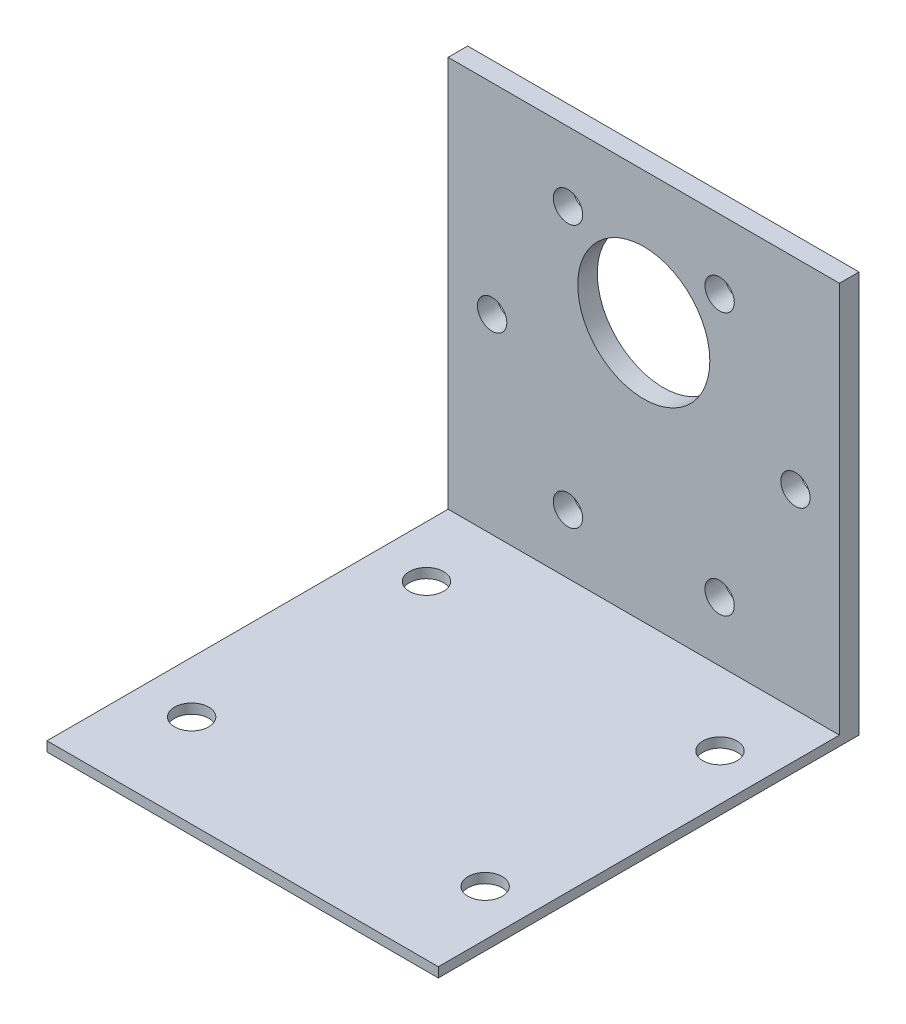
ISO-10303-21;
HEADER;
FILE_DESCRIPTION(('STEP AP214'),'2;1');
FILE_NAME('part.step','',(''),(''),'','','');
FILE_SCHEMA(('AUTOMOTIVE_DESIGN { 1 0 10303 214 1 1 1 1 }'));
ENDSEC;
DATA;
#1=APPLICATION_CONTEXT('core data for automotive mechanical design processes');
#2=APPLICATION_PROTOCOL_DEFINITION('international standard','automotive_design',2000,#1);
#3=PRODUCT_CONTEXT('',#1,'mechanical');
#4=PRODUCT('Part','Part','',(#3));
#5=PRODUCT_RELATED_PRODUCT_CATEGORY('part','',(#4));
#6=PRODUCT_DEFINITION_FORMATION('','',#4);
#7=PRODUCT_DEFINITION_CONTEXT('part definition',#1,'design');
#8=PRODUCT_DEFINITION('design','',#6,#7);
#9=PRODUCT_DEFINITION_SHAPE('','',#8);
#10=(LENGTH_UNIT() NAMED_UNIT(*) SI_UNIT(.MILLI.,.METRE.));
#11=(NAMED_UNIT(*) PLANE_ANGLE_UNIT() SI_UNIT($,.RADIAN.));
#12=(NAMED_UNIT(*) SI_UNIT($,.STERADIAN.) SOLID_ANGLE_UNIT());
#13=UNCERTAINTY_MEASURE_WITH_UNIT(LENGTH_MEASURE(1.E-05),#10,'distance_accuracy_value','');
#14=(GEOMETRIC_REPRESENTATION_CONTEXT(3) GLOBAL_UNCERTAINTY_ASSIGNED_CONTEXT((#13)) GLOBAL_UNIT_ASSIGNED_CONTEXT((#10,
#11,#12)) REPRESENTATION_CONTEXT('',''));
#15=CARTESIAN_POINT('',(0.,0.,0.));
#16=DIRECTION('',(0.,0.,1.));
#17=DIRECTION('',(1.,0.,0.));
#18=AXIS2_PLACEMENT_3D('',#15,#16,#17);
#19=CARTESIAN_POINT('',(0.,-1.,21.5));
#20=DIRECTION('',(0.,0.,1.));
#21=DIRECTION('',(1.,0.,0.));
#22=AXIS2_PLACEMENT_3D('',#19,#20,#21);
#23=PLANE('',#22);
#24=DIRECTION('',(1.,0.,0.));
#25=VECTOR('',#24,1.);
#26=CARTESIAN_POINT('',(0.,0.,21.5));
#27=LINE('',#26,#25);
#28=CARTESIAN_POINT('',(-20.,0.,21.5));
#29=VERTEX_POINT('',#28);
#30=CARTESIAN_POINT('',(20.,0.,21.5));
#31=VERTEX_POINT('',#30);
#32=EDGE_CURVE('E154',#29,#31,#27,.T.);
#33=ORIENTED_EDGE('',*,*,#32,.F.);
#34=DIRECTION('',(0.,1.,0.));
#35=VECTOR('',#34,1.);
#36=CARTESIAN_POINT('',(-20.,-1.,21.5));
#37=LINE('',#36,#35);
#38=CARTESIAN_POINT('',(-20.,-1.,21.5));
#39=VERTEX_POINT('',#38);
#40=EDGE_CURVE('E11',#39,#29,#37,.T.);
#41=ORIENTED_EDGE('',*,*,#40,.F.);
#42=DIRECTION('',(1.,0.,0.));
#43=VECTOR('',#42,1.);
#44=CARTESIAN_POINT('',(0.,-1.,21.5));
#45=LINE('',#44,#43);
#46=CARTESIAN_POINT('',(20.,-1.,21.5));
#47=VERTEX_POINT('',#46);
#48=EDGE_CURVE('E137',#39,#47,#45,.T.);
#49=ORIENTED_EDGE('',*,*,#48,.T.);
#50=DIRECTION('',(0.,1.,0.));
#51=VECTOR('',#50,1.);
#52=CARTESIAN_POINT('',(20.,-1.,21.5));
#53=LINE('',#52,#51);
#54=EDGE_CURVE('E39',#47,#31,#53,.T.);
#55=ORIENTED_EDGE('',*,*,#54,.T.);
#56=EDGE_LOOP('',(#33,#41,#49,#55));
#57=FACE_BOUND('',#56,.T.);
#58=ADVANCED_FACE('F35',(#57),#23,.T.);
#59=CARTESIAN_POINT('',(-20.,-1.,0.));
#60=DIRECTION('',(1.,0.,0.));
#61=DIRECTION('',(0.,0.,-1.));
#62=AXIS2_PLACEMENT_3D('',#59,#60,#61);
#63=PLANE('',#62);
#64=DIRECTION('',(0.,0.,-1.));
#65=VECTOR('',#64,1.);
#66=CARTESIAN_POINT('',(-20.,0.,0.));
#67=LINE('',#66,#65);
#68=CARTESIAN_POINT('',(-20.,0.,-19.5));
#69=VERTEX_POINT('',#68);
#70=EDGE_CURVE('E116',#29,#69,#67,.T.);
#71=ORIENTED_EDGE('',*,*,#70,.T.);
#72=DIRECTION('',(0.,-1.,0.));
#73=VECTOR('',#72,1.);
#74=CARTESIAN_POINT('',(-20.,40.,-19.5));
#75=LINE('',#74,#73);
#76=CARTESIAN_POINT('',(-20.,40.,-19.5));
#77=VERTEX_POINT('',#76);
#78=EDGE_CURVE('E99',#77,#69,#75,.T.);
#79=ORIENTED_EDGE('',*,*,#78,.F.);
#80=DIRECTION('',(0.,0.,1.));
#81=VECTOR('',#80,1.);
#82=CARTESIAN_POINT('',(-20.,40.,0.));
#83=LINE('',#82,#81);
#84=CARTESIAN_POINT('',(-20.,40.,-21.5));
#85=VERTEX_POINT('',#84);
#86=EDGE_CURVE('E106',#85,#77,#83,.T.);
#87=ORIENTED_EDGE('',*,*,#86,.F.);
#88=DIRECTION('',(0.,1.,0.));
#89=VECTOR('',#88,1.);
#90=CARTESIAN_POINT('',(-20.,-1.,-21.5));
#91=LINE('',#90,#89);
#92=CARTESIAN_POINT('',(-20.,-1.,-21.5));
#93=VERTEX_POINT('',#92);
#94=EDGE_CURVE('E44',#93,#85,#91,.T.);
#95=ORIENTED_EDGE('',*,*,#94,.F.);
#96=DIRECTION('',(0.,0.,-1.));
#97=VECTOR('',#96,1.);
#98=CARTESIAN_POINT('',(-20.,-1.,0.));
#99=LINE('',#98,#97);
#100=EDGE_CURVE('E143',#39,#93,#99,.T.);
#101=ORIENTED_EDGE('',*,*,#100,.F.);
#102=ORIENTED_EDGE('',*,*,#40,.T.);
#103=EDGE_LOOP('',(#71,#79,#87,#95,#101,#102));
#104=FACE_BOUND('',#103,.T.);
#105=ADVANCED_FACE('F115',(#104),#63,.F.);
#106=CARTESIAN_POINT('',(0.,-1.,-21.5));
#107=DIRECTION('',(0.,0.,1.));
#108=DIRECTION('',(1.,0.,0.));
#109=AXIS2_PLACEMENT_3D('',#106,#107,#108);
#110=PLANE('',#109);
#111=CARTESIAN_POINT('',(-7.74999999999997,6.0766062413414,-21.5));
#112=DIRECTION('',(0.,0.,1.));
#113=DIRECTION('',(1.,0.,0.));
#114=AXIS2_PLACEMENT_3D('',#111,#112,#113);
#115=CIRCLE('',#114,1.5);
#116=CARTESIAN_POINT('',(-6.24999999999997,6.0766062413414,-21.5));
#117=VERTEX_POINT('',#116);
#118=EDGE_CURVE('E263',#117,#117,#115,.T.);
#119=ORIENTED_EDGE('',*,*,#118,.T.);
#120=EDGE_LOOP('',(#119));
#121=FACE_BOUND('',#120,.T.);
#122=CARTESIAN_POINT('',(-15.5,19.5,-21.5));
#123=DIRECTION('',(0.,0.,1.));
#124=DIRECTION('',(1.,0.,0.));
#125=AXIS2_PLACEMENT_3D('',#122,#123,#124);
#126=CIRCLE('',#125,1.5);
#127=CARTESIAN_POINT('',(-14.,19.5,-21.5));
#128=VERTEX_POINT('',#127);
#129=EDGE_CURVE('E260',#128,#128,#126,.T.);
#130=ORIENTED_EDGE('',*,*,#129,.T.);
#131=EDGE_LOOP('',(#130));
#132=FACE_BOUND('',#131,.T.);
#133=CARTESIAN_POINT('',(-7.75000000000015,32.9233937586589,-21.5));
#134=DIRECTION('',(0.,0.,1.));
#135=DIRECTION('',(1.,0.,0.));
#136=AXIS2_PLACEMENT_3D('',#133,#134,#135);
#137=CIRCLE('',#136,1.5);
#138=CARTESIAN_POINT('',(-6.25000000000015,32.9233937586589,-21.5));
#139=VERTEX_POINT('',#138);
#140=EDGE_CURVE('E251',#139,#139,#137,.T.);
#141=ORIENTED_EDGE('',*,*,#140,.T.);
#142=EDGE_LOOP('',(#141));
#143=FACE_BOUND('',#142,.T.);
#144=CARTESIAN_POINT('',(7.74999999999987,32.9233937586591,-21.5));
#145=DIRECTION('',(0.,0.,1.));
#146=DIRECTION('',(1.,0.,0.));
#147=AXIS2_PLACEMENT_3D('',#144,#145,#146);
#148=CIRCLE('',#147,1.5);
#149=CARTESIAN_POINT('',(9.24999999999987,32.9233937586591,-21.5));
#150=VERTEX_POINT('',#149);
#151=EDGE_CURVE('E247',#150,#150,#148,.T.);
#152=ORIENTED_EDGE('',*,*,#151,.T.);
#153=EDGE_LOOP('',(#152));
#154=FACE_BOUND('',#153,.T.);
#155=CARTESIAN_POINT('',(15.5,19.5000000000003,-21.5));
#156=DIRECTION('',(0.,0.,1.));
#157=DIRECTION('',(1.,0.,0.));
#158=AXIS2_PLACEMENT_3D('',#155,#156,#157);
#159=CIRCLE('',#158,1.5);
#160=CARTESIAN_POINT('',(17.,19.5000000000003,-21.5));
#161=VERTEX_POINT('',#160);
#162=EDGE_CURVE('E245',#161,#161,#159,.T.);
#163=ORIENTED_EDGE('',*,*,#162,.T.);
#164=EDGE_LOOP('',(#163));
#165=FACE_BOUND('',#164,.T.);
#166=CARTESIAN_POINT('',(7.75000000000007,6.07660624134145,-21.5));
#167=DIRECTION('',(0.,0.,1.));
#168=DIRECTION('',(1.,0.,0.));
#169=AXIS2_PLACEMENT_3D('',#166,#167,#168);
#170=CIRCLE('',#169,1.5);
#171=CARTESIAN_POINT('',(9.25000000000007,6.07660624134145,-21.5));
#172=VERTEX_POINT('',#171);
#173=EDGE_CURVE('E248',#172,#172,#170,.T.);
#174=ORIENTED_EDGE('',*,*,#173,.T.);
#175=EDGE_LOOP('',(#174));
#176=FACE_BOUND('',#175,.T.);
#177=CARTESIAN_POINT('',(0.,26.5,-21.5));
#178=DIRECTION('',(0.,0.,1.));
#179=DIRECTION('',(1.,0.,0.));
#180=AXIS2_PLACEMENT_3D('',#177,#178,#179);
#181=CIRCLE('',#180,6.75);
#182=CARTESIAN_POINT('',(6.75,26.5,-21.5));
#183=VERTEX_POINT('',#182);
#184=EDGE_CURVE('E269',#183,#183,#181,.T.);
#185=ORIENTED_EDGE('',*,*,#184,.T.);
#186=EDGE_LOOP('',(#185));
#187=FACE_BOUND('',#186,.T.);
#188=ORIENTED_EDGE('',*,*,#94,.T.);
#189=DIRECTION('',(-1.,0.,0.));
#190=VECTOR('',#189,1.);
#191=CARTESIAN_POINT('',(0.,40.,-21.5));
#192=LINE('',#191,#190);
#193=CARTESIAN_POINT('',(20.,40.,-21.5));
#194=VERTEX_POINT('',#193);
#195=EDGE_CURVE('E112',#194,#85,#192,.T.);
#196=ORIENTED_EDGE('',*,*,#195,.F.);
#197=DIRECTION('',(0.,1.,0.));
#198=VECTOR('',#197,1.);
#199=CARTESIAN_POINT('',(20.,-1.,-21.5));
#200=LINE('',#199,#198);
#201=CARTESIAN_POINT('',(20.,-1.,-21.5));
#202=VERTEX_POINT('',#201);
#203=EDGE_CURVE('E160',#202,#194,#200,.T.);
#204=ORIENTED_EDGE('',*,*,#203,.F.);
#205=DIRECTION('',(1.,0.,0.));
#206=VECTOR('',#205,1.);
#207=CARTESIAN_POINT('',(0.,-1.,-21.5));
#208=LINE('',#207,#206);
#209=EDGE_CURVE('E141',#93,#202,#208,.T.);
#210=ORIENTED_EDGE('',*,*,#209,.F.);
#211=EDGE_LOOP('',(#188,#196,#204,#210));
#212=FACE_BOUND('',#211,.T.);
#213=ADVANCED_FACE('F180',(#121,#132,#143,#154,#165,#176,#187,#212),#110,.F.);
#214=CARTESIAN_POINT('',(-14.7150530034863,-1.,-12.));
#215=DIRECTION('',(0.,1.,0.));
#216=DIRECTION('',(0.,0.,1.));
#217=AXIS2_PLACEMENT_3D('',#214,#215,#216);
#218=CYLINDRICAL_SURFACE('',#217,1.75);
#219=CARTESIAN_POINT('',(-14.7150530034863,-1.,-12.));
#220=DIRECTION('',(0.,1.,0.));
#221=DIRECTION('',(0.,0.,1.));
#222=AXIS2_PLACEMENT_3D('',#219,#220,#221);
#223=CIRCLE('',#222,1.75);
#224=CARTESIAN_POINT('',(-14.7150530034863,-1.,-10.25));
#225=VERTEX_POINT('',#224);
#226=EDGE_CURVE('E134',#225,#225,#223,.T.);
#227=ORIENTED_EDGE('',*,*,#226,.F.);
#228=EDGE_LOOP('',(#227));
#229=FACE_BOUND('',#228,.T.);
#230=CARTESIAN_POINT('',(-14.7150530034863,0.,-12.));
#231=DIRECTION('',(0.,1.,0.));
#232=DIRECTION('',(0.,0.,1.));
#233=AXIS2_PLACEMENT_3D('',#230,#231,#232);
#234=CIRCLE('',#233,1.75);
#235=CARTESIAN_POINT('',(-14.7150530034863,0.,-10.25));
#236=VERTEX_POINT('',#235);
#237=EDGE_CURVE('E151',#236,#236,#234,.T.);
#238=ORIENTED_EDGE('',*,*,#237,.T.);
#239=EDGE_LOOP('',(#238));
#240=FACE_BOUND('',#239,.T.);
#241=ADVANCED_FACE('F177',(#229,#240),#218,.F.);
#242=CARTESIAN_POINT('',(15.2849469965137,-1.,-12.));
#243=DIRECTION('',(0.,1.,0.));
#244=DIRECTION('',(0.,0.,1.));
#245=AXIS2_PLACEMENT_3D('',#242,#243,#244);
#246=CYLINDRICAL_SURFACE('',#245,1.75);
#247=CARTESIAN_POINT('',(15.2849469965137,-1.,-12.));
#248=DIRECTION('',(0.,1.,0.));
#249=DIRECTION('',(0.,0.,1.));
#250=AXIS2_PLACEMENT_3D('',#247,#248,#249);
#251=CIRCLE('',#250,1.75);
#252=CARTESIAN_POINT('',(15.2849469965137,-1.,-10.25));
#253=VERTEX_POINT('',#252);
#254=EDGE_CURVE('E131',#253,#253,#251,.T.);
#255=ORIENTED_EDGE('',*,*,#254,.F.);
#256=EDGE_LOOP('',(#255));
#257=FACE_BOUND('',#256,.T.);
#258=CARTESIAN_POINT('',(15.2849469965137,0.,-12.));
#259=DIRECTION('',(0.,1.,0.));
#260=DIRECTION('',(0.,0.,1.));
#261=AXIS2_PLACEMENT_3D('',#258,#259,#260);
#262=CIRCLE('',#261,1.75);
#263=CARTESIAN_POINT('',(15.2849469965137,0.,-10.25));
#264=VERTEX_POINT('',#263);
#265=EDGE_CURVE('E148',#264,#264,#262,.T.);
#266=ORIENTED_EDGE('',*,*,#265,.T.);
#267=EDGE_LOOP('',(#266));
#268=FACE_BOUND('',#267,.T.);
#269=ADVANCED_FACE('F179',(#257,#268),#246,.F.);
#270=CARTESIAN_POINT('',(-14.7150530034863,-1.,12.));
#271=DIRECTION('',(0.,1.,0.));
#272=DIRECTION('',(0.,0.,1.));
#273=AXIS2_PLACEMENT_3D('',#270,#271,#272);
#274=CYLINDRICAL_SURFACE('',#273,1.75);
#275=CARTESIAN_POINT('',(-14.7150530034863,-1.,12.));
#276=DIRECTION('',(0.,1.,0.));
#277=DIRECTION('',(0.,0.,1.));
#278=AXIS2_PLACEMENT_3D('',#275,#276,#277);
#279=CIRCLE('',#278,1.75);
#280=CARTESIAN_POINT('',(-14.7150530034863,-1.,13.75));
#281=VERTEX_POINT('',#280);
#282=EDGE_CURVE('E128',#281,#281,#279,.T.);
#283=ORIENTED_EDGE('',*,*,#282,.F.);
#284=EDGE_LOOP('',(#283));
#285=FACE_BOUND('',#284,.T.);
#286=CARTESIAN_POINT('',(-14.7150530034863,0.,12.));
#287=DIRECTION('',(0.,1.,0.));
#288=DIRECTION('',(0.,0.,1.));
#289=AXIS2_PLACEMENT_3D('',#286,#287,#288);
#290=CIRCLE('',#289,1.75);
#291=CARTESIAN_POINT('',(-14.7150530034863,0.,13.75));
#292=VERTEX_POINT('',#291);
#293=EDGE_CURVE('E120',#292,#292,#290,.T.);
#294=ORIENTED_EDGE('',*,*,#293,.T.);
#295=EDGE_LOOP('',(#294));
#296=FACE_BOUND('',#295,.T.);
#297=ADVANCED_FACE('F187',(#285,#296),#274,.F.);
#298=CARTESIAN_POINT('',(15.2849469965137,-1.,12.));
#299=DIRECTION('',(0.,1.,0.));
#300=DIRECTION('',(0.,0.,1.));
#301=AXIS2_PLACEMENT_3D('',#298,#299,#300);
#302=CYLINDRICAL_SURFACE('',#301,1.75);
#303=CARTESIAN_POINT('',(15.2849469965137,-1.,12.));
#304=DIRECTION('',(0.,1.,0.));
#305=DIRECTION('',(0.,0.,1.));
#306=AXIS2_PLACEMENT_3D('',#303,#304,#305);
#307=CIRCLE('',#306,1.75);
#308=CARTESIAN_POINT('',(15.2849469965137,-1.,13.75));
#309=VERTEX_POINT('',#308);
#310=EDGE_CURVE('E125',#309,#309,#307,.T.);
#311=ORIENTED_EDGE('',*,*,#310,.F.);
#312=EDGE_LOOP('',(#311));
#313=FACE_BOUND('',#312,.T.);
#314=CARTESIAN_POINT('',(15.2849469965137,0.,12.));
#315=DIRECTION('',(0.,1.,0.));
#316=DIRECTION('',(0.,0.,1.));
#317=AXIS2_PLACEMENT_3D('',#314,#315,#316);
#318=CIRCLE('',#317,1.75);
#319=CARTESIAN_POINT('',(15.2849469965137,0.,13.75));
#320=VERTEX_POINT('',#319);
#321=EDGE_CURVE('E117',#320,#320,#318,.T.);
#322=ORIENTED_EDGE('',*,*,#321,.T.);
#323=EDGE_LOOP('',(#322));
#324=FACE_BOUND('',#323,.T.);
#325=ADVANCED_FACE('F37',(#313,#324),#302,.F.);
#326=CARTESIAN_POINT('',(20.,-1.,0.));
#327=DIRECTION('',(1.,0.,0.));
#328=DIRECTION('',(0.,0.,-1.));
#329=AXIS2_PLACEMENT_3D('',#326,#327,#328);
#330=PLANE('',#329);
#331=DIRECTION('',(0.,0.,-1.));
#332=VECTOR('',#331,1.);
#333=CARTESIAN_POINT('',(20.,0.,0.));
#334=LINE('',#333,#332);
#335=CARTESIAN_POINT('',(20.,0.,-19.5));
#336=VERTEX_POINT('',#335);
#337=EDGE_CURVE('E157',#31,#336,#334,.T.);
#338=ORIENTED_EDGE('',*,*,#337,.F.);
#339=ORIENTED_EDGE('',*,*,#54,.F.);
#340=DIRECTION('',(0.,0.,-1.));
#341=VECTOR('',#340,1.);
#342=CARTESIAN_POINT('',(20.,-1.,0.));
#343=LINE('',#342,#341);
#344=EDGE_CURVE('E139',#47,#202,#343,.T.);
#345=ORIENTED_EDGE('',*,*,#344,.T.);
#346=ORIENTED_EDGE('',*,*,#203,.T.);
#347=DIRECTION('',(0.,0.,-1.));
#348=VECTOR('',#347,1.);
#349=CARTESIAN_POINT('',(20.,40.,0.));
#350=LINE('',#349,#348);
#351=CARTESIAN_POINT('',(20.,40.,-19.5));
#352=VERTEX_POINT('',#351);
#353=EDGE_CURVE('E105',#352,#194,#350,.T.);
#354=ORIENTED_EDGE('',*,*,#353,.F.);
#355=DIRECTION('',(0.,-1.,0.));
#356=VECTOR('',#355,1.);
#357=CARTESIAN_POINT('',(20.,40.,-19.5));
#358=LINE('',#357,#356);
#359=EDGE_CURVE('E101',#352,#336,#358,.T.);
#360=ORIENTED_EDGE('',*,*,#359,.T.);
#361=EDGE_LOOP('',(#338,#339,#345,#346,#354,#360));
#362=FACE_BOUND('',#361,.T.);
#363=ADVANCED_FACE('F163',(#362),#330,.T.);
#364=CARTESIAN_POINT('',(0.,-1.,0.));
#365=DIRECTION('',(0.,1.,0.));
#366=DIRECTION('',(0.,0.,1.));
#367=AXIS2_PLACEMENT_3D('',#364,#365,#366);
#368=PLANE('',#367);
#369=ORIENTED_EDGE('',*,*,#310,.T.);
#370=EDGE_LOOP('',(#369));
#371=FACE_BOUND('',#370,.T.);
#372=ORIENTED_EDGE('',*,*,#282,.T.);
#373=EDGE_LOOP('',(#372));
#374=FACE_BOUND('',#373,.T.);
#375=ORIENTED_EDGE('',*,*,#254,.T.);
#376=EDGE_LOOP('',(#375));
#377=FACE_BOUND('',#376,.T.);
#378=ORIENTED_EDGE('',*,*,#226,.T.);
#379=EDGE_LOOP('',(#378));
#380=FACE_BOUND('',#379,.T.);
#381=ORIENTED_EDGE('',*,*,#48,.F.);
#382=ORIENTED_EDGE('',*,*,#100,.T.);
#383=ORIENTED_EDGE('',*,*,#209,.T.);
#384=ORIENTED_EDGE('',*,*,#344,.F.);
#385=EDGE_LOOP('',(#381,#382,#383,#384));
#386=FACE_BOUND('',#385,.T.);
#387=ADVANCED_FACE('F167',(#371,#374,#377,#380,#386),#368,.F.);
#388=CARTESIAN_POINT('',(0.,0.,0.));
#389=DIRECTION('',(0.,1.,0.));
#390=DIRECTION('',(0.,0.,1.));
#391=AXIS2_PLACEMENT_3D('',#388,#389,#390);
#392=PLANE('',#391);
#393=DIRECTION('',(1.,0.,0.));
#394=VECTOR('',#393,1.);
#395=CARTESIAN_POINT('',(0.,0.,-19.5));
#396=LINE('',#395,#394);
#397=EDGE_CURVE('E52',#69,#336,#396,.T.);
#398=ORIENTED_EDGE('',*,*,#397,.F.);
#399=ORIENTED_EDGE('',*,*,#70,.F.);
#400=ORIENTED_EDGE('',*,*,#32,.T.);
#401=ORIENTED_EDGE('',*,*,#337,.T.);
#402=EDGE_LOOP('',(#398,#399,#400,#401));
#403=FACE_BOUND('',#402,.T.);
#404=ORIENTED_EDGE('',*,*,#321,.F.);
#405=EDGE_LOOP('',(#404));
#406=FACE_BOUND('',#405,.T.);
#407=ORIENTED_EDGE('',*,*,#293,.F.);
#408=EDGE_LOOP('',(#407));
#409=FACE_BOUND('',#408,.T.);
#410=ORIENTED_EDGE('',*,*,#265,.F.);
#411=EDGE_LOOP('',(#410));
#412=FACE_BOUND('',#411,.T.);
#413=ORIENTED_EDGE('',*,*,#237,.F.);
#414=EDGE_LOOP('',(#413));
#415=FACE_BOUND('',#414,.T.);
#416=ADVANCED_FACE('F164',(#403,#406,#409,#412,#415),#392,.T.);
#417=CARTESIAN_POINT('',(0.,40.,-19.5));
#418=DIRECTION('',(0.,0.,-1.));
#419=DIRECTION('',(-1.,0.,0.));
#420=AXIS2_PLACEMENT_3D('',#417,#418,#419);
#421=PLANE('',#420);
#422=CARTESIAN_POINT('',(-7.74999999999997,6.0766062413414,-19.5));
#423=DIRECTION('',(0.,0.,1.));
#424=DIRECTION('',(1.,0.,0.));
#425=AXIS2_PLACEMENT_3D('',#422,#423,#424);
#426=CIRCLE('',#425,1.5);
#427=CARTESIAN_POINT('',(-6.24999999999997,6.0766062413414,-19.5));
#428=VERTEX_POINT('',#427);
#429=EDGE_CURVE('E296',#428,#428,#426,.T.);
#430=ORIENTED_EDGE('',*,*,#429,.F.);
#431=EDGE_LOOP('',(#430));
#432=FACE_BOUND('',#431,.T.);
#433=CARTESIAN_POINT('',(-15.5,19.5,-19.5));
#434=DIRECTION('',(0.,0.,1.));
#435=DIRECTION('',(1.,0.,0.));
#436=AXIS2_PLACEMENT_3D('',#433,#434,#435);
#437=CIRCLE('',#436,1.5);
#438=CARTESIAN_POINT('',(-14.,19.5,-19.5));
#439=VERTEX_POINT('',#438);
#440=EDGE_CURVE('E299',#439,#439,#437,.T.);
#441=ORIENTED_EDGE('',*,*,#440,.F.);
#442=EDGE_LOOP('',(#441));
#443=FACE_BOUND('',#442,.T.);
#444=CARTESIAN_POINT('',(-7.75000000000015,32.9233937586589,-19.5));
#445=DIRECTION('',(0.,0.,1.));
#446=DIRECTION('',(1.,0.,0.));
#447=AXIS2_PLACEMENT_3D('',#444,#445,#446);
#448=CIRCLE('',#447,1.5);
#449=CARTESIAN_POINT('',(-6.25000000000015,32.9233937586589,-19.5));
#450=VERTEX_POINT('',#449);
#451=EDGE_CURVE('E302',#450,#450,#448,.T.);
#452=ORIENTED_EDGE('',*,*,#451,.F.);
#453=EDGE_LOOP('',(#452));
#454=FACE_BOUND('',#453,.T.);
#455=CARTESIAN_POINT('',(7.74999999999987,32.9233937586591,-19.5));
#456=DIRECTION('',(0.,0.,1.));
#457=DIRECTION('',(1.,0.,0.));
#458=AXIS2_PLACEMENT_3D('',#455,#456,#457);
#459=CIRCLE('',#458,1.5);
#460=CARTESIAN_POINT('',(9.24999999999987,32.9233937586591,-19.5));
#461=VERTEX_POINT('',#460);
#462=EDGE_CURVE('E305',#461,#461,#459,.T.);
#463=ORIENTED_EDGE('',*,*,#462,.F.);
#464=EDGE_LOOP('',(#463));
#465=FACE_BOUND('',#464,.T.);
#466=CARTESIAN_POINT('',(15.5,19.5000000000003,-19.5));
#467=DIRECTION('',(0.,0.,1.));
#468=DIRECTION('',(1.,0.,0.));
#469=AXIS2_PLACEMENT_3D('',#466,#467,#468);
#470=CIRCLE('',#469,1.5);
#471=CARTESIAN_POINT('',(17.,19.5000000000003,-19.5));
#472=VERTEX_POINT('',#471);
#473=EDGE_CURVE('E242',#472,#472,#470,.T.);
#474=ORIENTED_EDGE('',*,*,#473,.F.);
#475=EDGE_LOOP('',(#474));
#476=FACE_BOUND('',#475,.T.);
#477=CARTESIAN_POINT('',(7.75000000000007,6.07660624134145,-19.5));
#478=DIRECTION('',(0.,0.,1.));
#479=DIRECTION('',(1.,0.,0.));
#480=AXIS2_PLACEMENT_3D('',#477,#478,#479);
#481=CIRCLE('',#480,1.5);
#482=CARTESIAN_POINT('',(9.25000000000007,6.07660624134145,-19.5));
#483=VERTEX_POINT('',#482);
#484=EDGE_CURVE('E254',#483,#483,#481,.T.);
#485=ORIENTED_EDGE('',*,*,#484,.F.);
#486=EDGE_LOOP('',(#485));
#487=FACE_BOUND('',#486,.T.);
#488=CARTESIAN_POINT('',(0.,26.5,-19.5));
#489=DIRECTION('',(0.,0.,1.));
#490=DIRECTION('',(1.,0.,0.));
#491=AXIS2_PLACEMENT_3D('',#488,#489,#490);
#492=CIRCLE('',#491,6.75);
#493=CARTESIAN_POINT('',(6.75,26.5,-19.5));
#494=VERTEX_POINT('',#493);
#495=EDGE_CURVE('E266',#494,#494,#492,.T.);
#496=ORIENTED_EDGE('',*,*,#495,.F.);
#497=EDGE_LOOP('',(#496));
#498=FACE_BOUND('',#497,.T.);
#499=ORIENTED_EDGE('',*,*,#397,.T.);
#500=ORIENTED_EDGE('',*,*,#359,.F.);
#501=DIRECTION('',(1.,0.,0.));
#502=VECTOR('',#501,1.);
#503=CARTESIAN_POINT('',(0.,40.,-19.5));
#504=LINE('',#503,#502);
#505=EDGE_CURVE('E95',#77,#352,#504,.T.);
#506=ORIENTED_EDGE('',*,*,#505,.F.);
#507=ORIENTED_EDGE('',*,*,#78,.T.);
#508=EDGE_LOOP('',(#499,#500,#506,#507));
#509=FACE_BOUND('',#508,.T.);
#510=ADVANCED_FACE('F97',(#432,#443,#454,#465,#476,#487,#498,#509),#421,.F.);
#511=CARTESIAN_POINT('',(0.,40.,0.));
#512=DIRECTION('',(0.,1.,0.));
#513=DIRECTION('',(0.,0.,1.));
#514=AXIS2_PLACEMENT_3D('',#511,#512,#513);
#515=PLANE('',#514);
#516=ORIENTED_EDGE('',*,*,#86,.T.);
#517=ORIENTED_EDGE('',*,*,#505,.T.);
#518=ORIENTED_EDGE('',*,*,#353,.T.);
#519=ORIENTED_EDGE('',*,*,#195,.T.);
#520=EDGE_LOOP('',(#516,#517,#518,#519));
#521=FACE_BOUND('',#520,.T.);
#522=ADVANCED_FACE('F110',(#521),#515,.T.);
#523=CARTESIAN_POINT('',(0.,26.5,-53.5));
#524=DIRECTION('',(0.,0.,1.));
#525=DIRECTION('',(1.,0.,0.));
#526=AXIS2_PLACEMENT_3D('',#523,#524,#525);
#527=CYLINDRICAL_SURFACE('',#526,6.75);
#528=ORIENTED_EDGE('',*,*,#495,.T.);
#529=EDGE_LOOP('',(#528));
#530=FACE_BOUND('',#529,.T.);
#531=ORIENTED_EDGE('',*,*,#184,.F.);
#532=EDGE_LOOP('',(#531));
#533=FACE_BOUND('',#532,.T.);
#534=ADVANCED_FACE('F210',(#530,#533),#527,.F.);
#535=CARTESIAN_POINT('',(7.75000000000007,6.07660624134145,-29.5));
#536=DIRECTION('',(0.,0.,1.));
#537=DIRECTION('',(1.,0.,0.));
#538=AXIS2_PLACEMENT_3D('',#535,#536,#537);
#539=CYLINDRICAL_SURFACE('',#538,1.5);
#540=ORIENTED_EDGE('',*,*,#484,.T.);
#541=EDGE_LOOP('',(#540));
#542=FACE_BOUND('',#541,.T.);
#543=ORIENTED_EDGE('',*,*,#173,.F.);
#544=EDGE_LOOP('',(#543));
#545=FACE_BOUND('',#544,.T.);
#546=ADVANCED_FACE('F213',(#542,#545),#539,.F.);
#547=CARTESIAN_POINT('',(15.5,19.5000000000003,-29.5));
#548=DIRECTION('',(0.,0.,1.));
#549=DIRECTION('',(1.,0.,0.));
#550=AXIS2_PLACEMENT_3D('',#547,#548,#549);
#551=CYLINDRICAL_SURFACE('',#550,1.5);
#552=ORIENTED_EDGE('',*,*,#473,.T.);
#553=EDGE_LOOP('',(#552));
#554=FACE_BOUND('',#553,.T.);
#555=ORIENTED_EDGE('',*,*,#162,.F.);
#556=EDGE_LOOP('',(#555));
#557=FACE_BOUND('',#556,.T.);
#558=ADVANCED_FACE('F217',(#554,#557),#551,.F.);
#559=CARTESIAN_POINT('',(7.74999999999987,32.9233937586591,-29.5));
#560=DIRECTION('',(0.,0.,1.));
#561=DIRECTION('',(1.,0.,0.));
#562=AXIS2_PLACEMENT_3D('',#559,#560,#561);
#563=CYLINDRICAL_SURFACE('',#562,1.5);
#564=ORIENTED_EDGE('',*,*,#462,.T.);
#565=EDGE_LOOP('',(#564));
#566=FACE_BOUND('',#565,.T.);
#567=ORIENTED_EDGE('',*,*,#151,.F.);
#568=EDGE_LOOP('',(#567));
#569=FACE_BOUND('',#568,.T.);
#570=ADVANCED_FACE('F230',(#566,#569),#563,.F.);
#571=CARTESIAN_POINT('',(-7.75000000000015,32.9233937586589,-29.5));
#572=DIRECTION('',(0.,0.,1.));
#573=DIRECTION('',(1.,0.,0.));
#574=AXIS2_PLACEMENT_3D('',#571,#572,#573);
#575=CYLINDRICAL_SURFACE('',#574,1.5);
#576=ORIENTED_EDGE('',*,*,#451,.T.);
#577=EDGE_LOOP('',(#576));
#578=FACE_BOUND('',#577,.T.);
#579=ORIENTED_EDGE('',*,*,#140,.F.);
#580=EDGE_LOOP('',(#579));
#581=FACE_BOUND('',#580,.T.);
#582=ADVANCED_FACE('F226',(#578,#581),#575,.F.);
#583=CARTESIAN_POINT('',(-15.5,19.5,-29.5));
#584=DIRECTION('',(0.,0.,1.));
#585=DIRECTION('',(1.,0.,0.));
#586=AXIS2_PLACEMENT_3D('',#583,#584,#585);
#587=CYLINDRICAL_SURFACE('',#586,1.5);
#588=ORIENTED_EDGE('',*,*,#440,.T.);
#589=EDGE_LOOP('',(#588));
#590=FACE_BOUND('',#589,.T.);
#591=ORIENTED_EDGE('',*,*,#129,.F.);
#592=EDGE_LOOP('',(#591));
#593=FACE_BOUND('',#592,.T.);
#594=ADVANCED_FACE('F222',(#590,#593),#587,.F.);
#595=CARTESIAN_POINT('',(-7.74999999999997,6.0766062413414,-29.5));
#596=DIRECTION('',(0.,0.,1.));
#597=DIRECTION('',(1.,0.,0.));
#598=AXIS2_PLACEMENT_3D('',#595,#596,#597);
#599=CYLINDRICAL_SURFACE('',#598,1.5);
#600=ORIENTED_EDGE('',*,*,#429,.T.);
#601=EDGE_LOOP('',(#600));
#602=FACE_BOUND('',#601,.T.);
#603=ORIENTED_EDGE('',*,*,#118,.F.);
#604=EDGE_LOOP('',(#603));
#605=FACE_BOUND('',#604,.T.);
#606=ADVANCED_FACE('F219',(#602,#605),#599,.F.);
#607=CLOSED_SHELL('',(#58,#105,#213,#241,#269,#297,#325,#363,#387,#416,#510,#522,#534,#546,#558,
#570,#582,#594,#606));
#608=MANIFOLD_SOLID_BREP('B2',#607);
#609=ADVANCED_BREP_SHAPE_REPRESENTATION('',(#18,#608),#14);
#610=SHAPE_DEFINITION_REPRESENTATION(#9,#609);
ENDSEC;
END-ISO-10303-21;
